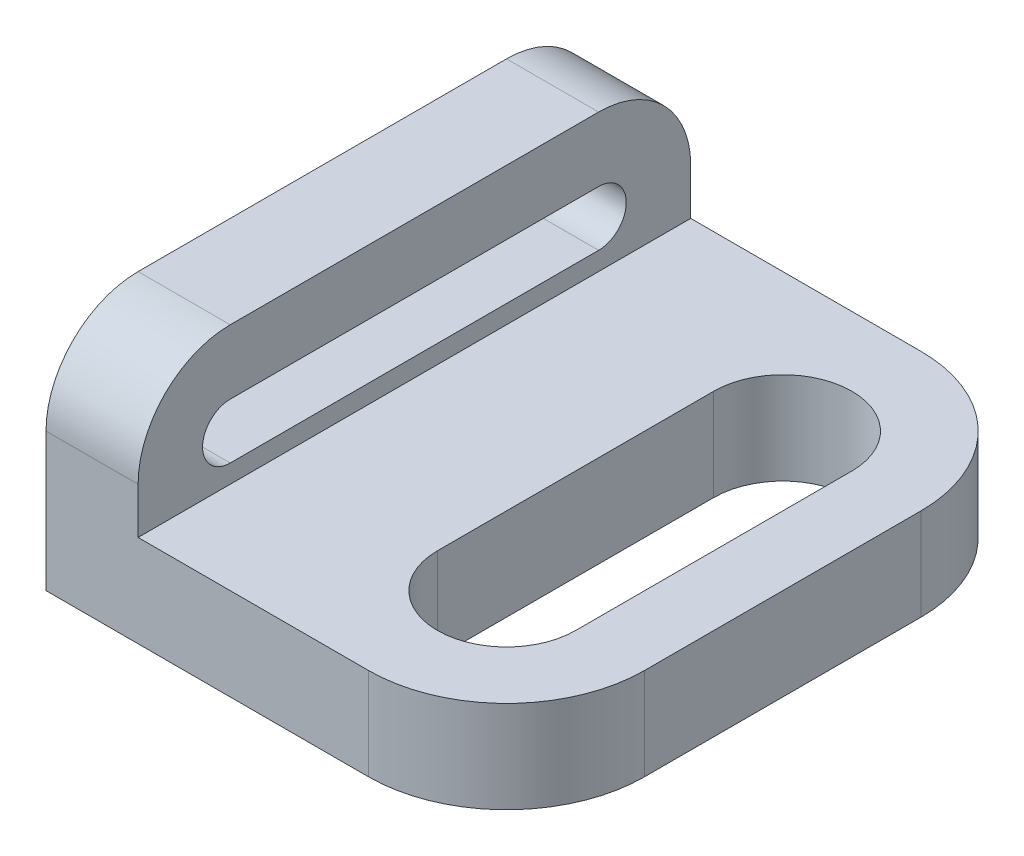
ISO-10303-21;
HEADER;
FILE_DESCRIPTION(('STEP AP214'),'2;1');
FILE_NAME('part.step','',(''),(''),'','','');
FILE_SCHEMA(('AUTOMOTIVE_DESIGN { 1 0 10303 214 1 1 1 1 }'));
ENDSEC;
DATA;
#1=APPLICATION_CONTEXT('core data for automotive mechanical design processes');
#2=APPLICATION_PROTOCOL_DEFINITION('international standard','automotive_design',2000,#1);
#3=PRODUCT_CONTEXT('',#1,'mechanical');
#4=PRODUCT('Part','Part','',(#3));
#5=PRODUCT_RELATED_PRODUCT_CATEGORY('part','',(#4));
#6=PRODUCT_DEFINITION_FORMATION('','',#4);
#7=PRODUCT_DEFINITION_CONTEXT('part definition',#1,'design');
#8=PRODUCT_DEFINITION('design','',#6,#7);
#9=PRODUCT_DEFINITION_SHAPE('','',#8);
#10=(LENGTH_UNIT() NAMED_UNIT(*) SI_UNIT(.MILLI.,.METRE.));
#11=(NAMED_UNIT(*) PLANE_ANGLE_UNIT() SI_UNIT($,.RADIAN.));
#12=(NAMED_UNIT(*) SI_UNIT($,.STERADIAN.) SOLID_ANGLE_UNIT());
#13=UNCERTAINTY_MEASURE_WITH_UNIT(LENGTH_MEASURE(1.E-05),#10,'distance_accuracy_value','');
#14=(GEOMETRIC_REPRESENTATION_CONTEXT(3) GLOBAL_UNCERTAINTY_ASSIGNED_CONTEXT((#13)) GLOBAL_UNIT_ASSIGNED_CONTEXT((#10,
#11,#12)) REPRESENTATION_CONTEXT('',''));
#15=CARTESIAN_POINT('',(0.,0.,0.));
#16=DIRECTION('',(0.,0.,1.));
#17=DIRECTION('',(1.,0.,0.));
#18=AXIS2_PLACEMENT_3D('',#15,#16,#17);
#19=CARTESIAN_POINT('',(0.,20.,0.));
#20=DIRECTION('',(0.,0.,-1.));
#21=DIRECTION('',(-1.,0.,0.));
#22=AXIS2_PLACEMENT_3D('',#19,#20,#21);
#23=PLANE('',#22);
#24=DIRECTION('',(0.,-1.,0.));
#25=VECTOR('',#24,1.);
#26=CARTESIAN_POINT('',(20.,50.,0.));
#27=LINE('',#26,#25);
#28=CARTESIAN_POINT('',(20.,30.,0.));
#29=VERTEX_POINT('',#28);
#30=CARTESIAN_POINT('',(20.,20.,0.));
#31=VERTEX_POINT('',#30);
#32=EDGE_CURVE('E229',#29,#31,#27,.T.);
#33=ORIENTED_EDGE('',*,*,#32,.F.);
#34=DIRECTION('',(1.,0.,0.));
#35=VECTOR('',#34,1.);
#36=CARTESIAN_POINT('',(0.,30.,0.));
#37=LINE('',#36,#35);
#38=CARTESIAN_POINT('',(0.,30.,0.));
#39=VERTEX_POINT('',#38);
#40=EDGE_CURVE('E11',#29,#39,#37,.F.);
#41=ORIENTED_EDGE('',*,*,#40,.T.);
#42=DIRECTION('',(0.,-1.,0.));
#43=VECTOR('',#42,1.);
#44=CARTESIAN_POINT('',(0.,50.,0.));
#45=LINE('',#44,#43);
#46=CARTESIAN_POINT('',(0.,0.,0.));
#47=VERTEX_POINT('',#46);
#48=EDGE_CURVE('E232',#39,#47,#45,.T.);
#49=ORIENTED_EDGE('',*,*,#48,.T.);
#50=DIRECTION('',(1.,0.,0.));
#51=VECTOR('',#50,1.);
#52=CARTESIAN_POINT('',(0.,0.,0.));
#53=LINE('',#52,#51);
#54=CARTESIAN_POINT('',(70.,0.,0.));
#55=VERTEX_POINT('',#54);
#56=EDGE_CURVE('E292',#47,#55,#53,.T.);
#57=ORIENTED_EDGE('',*,*,#56,.T.);
#58=DIRECTION('',(0.,-1.,0.));
#59=VECTOR('',#58,1.);
#60=CARTESIAN_POINT('',(70.,20.,0.));
#61=LINE('',#60,#59);
#62=CARTESIAN_POINT('',(70.,20.,0.));
#63=VERTEX_POINT('',#62);
#64=EDGE_CURVE('E321',#63,#55,#61,.T.);
#65=ORIENTED_EDGE('',*,*,#64,.F.);
#66=DIRECTION('',(1.,0.,0.));
#67=VECTOR('',#66,1.);
#68=CARTESIAN_POINT('',(0.,20.,0.));
#69=LINE('',#68,#67);
#70=EDGE_CURVE('E255',#31,#63,#69,.T.);
#71=ORIENTED_EDGE('',*,*,#70,.F.);
#72=EDGE_LOOP('',(#33,#41,#49,#57,#65,#71));
#73=FACE_BOUND('',#72,.T.);
#74=ADVANCED_FACE('F41',(#73),#23,.F.);
#75=CARTESIAN_POINT('',(70.,20.,-30.));
#76=DIRECTION('',(0.,-1.,0.));
#77=DIRECTION('',(0.,0.,-1.));
#78=AXIS2_PLACEMENT_3D('',#75,#76,#77);
#79=CYLINDRICAL_SURFACE('',#78,30.);
#80=CARTESIAN_POINT('',(70.,0.,-30.));
#81=DIRECTION('',(0.,1.,0.));
#82=DIRECTION('',(0.,0.,1.));
#83=AXIS2_PLACEMENT_3D('',#80,#81,#82);
#84=CIRCLE('',#83,30.);
#85=CARTESIAN_POINT('',(100.,0.,-30.));
#86=VERTEX_POINT('',#85);
#87=EDGE_CURVE('E296',#55,#86,#84,.T.);
#88=ORIENTED_EDGE('',*,*,#87,.T.);
#89=DIRECTION('',(0.,-1.,0.));
#90=VECTOR('',#89,1.);
#91=CARTESIAN_POINT('',(100.,20.,-30.));
#92=LINE('',#91,#90);
#93=CARTESIAN_POINT('',(100.,20.,-30.));
#94=VERTEX_POINT('',#93);
#95=EDGE_CURVE('E317',#94,#86,#92,.T.);
#96=ORIENTED_EDGE('',*,*,#95,.F.);
#97=CARTESIAN_POINT('',(70.,20.,-30.));
#98=DIRECTION('',(0.,1.,0.));
#99=DIRECTION('',(0.,0.,1.));
#100=AXIS2_PLACEMENT_3D('',#97,#98,#99);
#101=CIRCLE('',#100,30.);
#102=EDGE_CURVE('E259',#63,#94,#101,.T.);
#103=ORIENTED_EDGE('',*,*,#102,.F.);
#104=ORIENTED_EDGE('',*,*,#64,.T.);
#105=EDGE_LOOP('',(#88,#96,#103,#104));
#106=FACE_BOUND('',#105,.T.);
#107=ADVANCED_FACE('F397',(#106),#79,.T.);
#108=CARTESIAN_POINT('',(100.,20.,0.));
#109=DIRECTION('',(-1.,0.,0.));
#110=DIRECTION('',(0.,0.,1.));
#111=AXIS2_PLACEMENT_3D('',#108,#109,#110);
#112=PLANE('',#111);
#113=DIRECTION('',(0.,0.,-1.));
#114=VECTOR('',#113,1.);
#115=CARTESIAN_POINT('',(100.,0.,0.));
#116=LINE('',#115,#114);
#117=CARTESIAN_POINT('',(100.,0.,-90.));
#118=VERTEX_POINT('',#117);
#119=EDGE_CURVE('E299',#86,#118,#116,.T.);
#120=ORIENTED_EDGE('',*,*,#119,.T.);
#121=DIRECTION('',(0.,-1.,0.));
#122=VECTOR('',#121,1.);
#123=CARTESIAN_POINT('',(100.,20.,-90.));
#124=LINE('',#123,#122);
#125=CARTESIAN_POINT('',(100.,20.,-90.));
#126=VERTEX_POINT('',#125);
#127=EDGE_CURVE('E312',#126,#118,#124,.T.);
#128=ORIENTED_EDGE('',*,*,#127,.F.);
#129=DIRECTION('',(0.,0.,-1.));
#130=VECTOR('',#129,1.);
#131=CARTESIAN_POINT('',(100.,20.,0.));
#132=LINE('',#131,#130);
#133=EDGE_CURVE('E262',#94,#126,#132,.T.);
#134=ORIENTED_EDGE('',*,*,#133,.F.);
#135=ORIENTED_EDGE('',*,*,#95,.T.);
#136=EDGE_LOOP('',(#120,#128,#134,#135));
#137=FACE_BOUND('',#136,.T.);
#138=ADVANCED_FACE('F400',(#137),#112,.F.);
#139=CARTESIAN_POINT('',(70.,20.,-90.));
#140=DIRECTION('',(0.,-1.,0.));
#141=DIRECTION('',(0.,0.,-1.));
#142=AXIS2_PLACEMENT_3D('',#139,#140,#141);
#143=CYLINDRICAL_SURFACE('',#142,30.);
#144=CARTESIAN_POINT('',(70.,0.,-90.));
#145=DIRECTION('',(0.,1.,0.));
#146=DIRECTION('',(0.,0.,1.));
#147=AXIS2_PLACEMENT_3D('',#144,#145,#146);
#148=CIRCLE('',#147,30.);
#149=CARTESIAN_POINT('',(70.,0.,-120.));
#150=VERTEX_POINT('',#149);
#151=EDGE_CURVE('E302',#118,#150,#148,.T.);
#152=ORIENTED_EDGE('',*,*,#151,.T.);
#153=DIRECTION('',(0.,-1.,0.));
#154=VECTOR('',#153,1.);
#155=CARTESIAN_POINT('',(70.,20.,-120.));
#156=LINE('',#155,#154);
#157=CARTESIAN_POINT('',(70.,20.,-120.));
#158=VERTEX_POINT('',#157);
#159=EDGE_CURVE('E309',#158,#150,#156,.T.);
#160=ORIENTED_EDGE('',*,*,#159,.F.);
#161=CARTESIAN_POINT('',(70.,20.,-90.));
#162=DIRECTION('',(0.,1.,0.));
#163=DIRECTION('',(0.,0.,1.));
#164=AXIS2_PLACEMENT_3D('',#161,#162,#163);
#165=CIRCLE('',#164,30.);
#166=EDGE_CURVE('E265',#126,#158,#165,.T.);
#167=ORIENTED_EDGE('',*,*,#166,.F.);
#168=ORIENTED_EDGE('',*,*,#127,.T.);
#169=EDGE_LOOP('',(#152,#160,#167,#168));
#170=FACE_BOUND('',#169,.T.);
#171=ADVANCED_FACE('F390',(#170),#143,.T.);
#172=CARTESIAN_POINT('',(0.,20.,-120.));
#173=DIRECTION('',(0.,0.,-1.));
#174=DIRECTION('',(-1.,0.,0.));
#175=AXIS2_PLACEMENT_3D('',#172,#173,#174);
#176=PLANE('',#175);
#177=DIRECTION('',(0.,-1.,0.));
#178=VECTOR('',#177,1.);
#179=CARTESIAN_POINT('',(0.,50.,-120.));
#180=LINE('',#179,#178);
#181=CARTESIAN_POINT('',(0.,30.,-120.));
#182=VERTEX_POINT('',#181);
#183=CARTESIAN_POINT('',(0.,0.,-120.));
#184=VERTEX_POINT('',#183);
#185=EDGE_CURVE('E235',#182,#184,#180,.T.);
#186=ORIENTED_EDGE('',*,*,#185,.F.);
#187=DIRECTION('',(1.,0.,0.));
#188=VECTOR('',#187,1.);
#189=CARTESIAN_POINT('',(0.,30.,-120.));
#190=LINE('',#189,#188);
#191=CARTESIAN_POINT('',(20.,30.,-120.));
#192=VERTEX_POINT('',#191);
#193=EDGE_CURVE('E325',#182,#192,#190,.T.);
#194=ORIENTED_EDGE('',*,*,#193,.T.);
#195=DIRECTION('',(0.,-1.,0.));
#196=VECTOR('',#195,1.);
#197=CARTESIAN_POINT('',(20.,50.,-120.));
#198=LINE('',#197,#196);
#199=CARTESIAN_POINT('',(20.,20.,-120.));
#200=VERTEX_POINT('',#199);
#201=EDGE_CURVE('E223',#192,#200,#198,.T.);
#202=ORIENTED_EDGE('',*,*,#201,.T.);
#203=DIRECTION('',(1.,0.,0.));
#204=VECTOR('',#203,1.);
#205=CARTESIAN_POINT('',(0.,20.,-120.));
#206=LINE('',#205,#204);
#207=EDGE_CURVE('E268',#200,#158,#206,.T.);
#208=ORIENTED_EDGE('',*,*,#207,.T.);
#209=ORIENTED_EDGE('',*,*,#159,.T.);
#210=DIRECTION('',(1.,0.,0.));
#211=VECTOR('',#210,1.);
#212=CARTESIAN_POINT('',(0.,0.,-120.));
#213=LINE('',#212,#211);
#214=EDGE_CURVE('E244',#184,#150,#213,.T.);
#215=ORIENTED_EDGE('',*,*,#214,.F.);
#216=EDGE_LOOP('',(#186,#194,#202,#208,#209,#215));
#217=FACE_BOUND('',#216,.T.);
#218=ADVANCED_FACE('F364',(#217),#176,.T.);
#219=CARTESIAN_POINT('',(70.,20.,-30.));
#220=DIRECTION('',(0.,-1.,0.));
#221=DIRECTION('',(0.,0.,-1.));
#222=AXIS2_PLACEMENT_3D('',#219,#220,#221);
#223=CYLINDRICAL_SURFACE('',#222,15.);
#224=CARTESIAN_POINT('',(70.,0.,-30.));
#225=DIRECTION('',(0.,1.,0.));
#226=DIRECTION('',(0.,0.,1.));
#227=AXIS2_PLACEMENT_3D('',#224,#225,#226);
#228=CIRCLE('',#227,15.);
#229=CARTESIAN_POINT('',(55.,0.,-30.));
#230=VERTEX_POINT('',#229);
#231=CARTESIAN_POINT('',(85.,0.,-30.));
#232=VERTEX_POINT('',#231);
#233=EDGE_CURVE('E238',#230,#232,#228,.T.);
#234=ORIENTED_EDGE('',*,*,#233,.F.);
#235=DIRECTION('',(0.,-1.,0.));
#236=VECTOR('',#235,1.);
#237=CARTESIAN_POINT('',(55.,20.,-30.));
#238=LINE('',#237,#236);
#239=CARTESIAN_POINT('',(55.,20.,-30.));
#240=VERTEX_POINT('',#239);
#241=EDGE_CURVE('E313',#240,#230,#238,.T.);
#242=ORIENTED_EDGE('',*,*,#241,.F.);
#243=CARTESIAN_POINT('',(70.,20.,-30.));
#244=DIRECTION('',(0.,1.,0.));
#245=DIRECTION('',(0.,0.,1.));
#246=AXIS2_PLACEMENT_3D('',#243,#244,#245);
#247=CIRCLE('',#246,15.);
#248=CARTESIAN_POINT('',(85.,20.,-30.));
#249=VERTEX_POINT('',#248);
#250=EDGE_CURVE('E239',#240,#249,#247,.T.);
#251=ORIENTED_EDGE('',*,*,#250,.T.);
#252=DIRECTION('',(0.,-1.,0.));
#253=VECTOR('',#252,1.);
#254=CARTESIAN_POINT('',(85.,20.,-30.));
#255=LINE('',#254,#253);
#256=EDGE_CURVE('E276',#249,#232,#255,.T.);
#257=ORIENTED_EDGE('',*,*,#256,.T.);
#258=EDGE_LOOP('',(#234,#242,#251,#257));
#259=FACE_BOUND('',#258,.T.);
#260=ADVANCED_FACE('F425',(#259),#223,.F.);
#261=CARTESIAN_POINT('',(55.,20.,0.));
#262=DIRECTION('',(1.,0.,0.));
#263=DIRECTION('',(0.,0.,-1.));
#264=AXIS2_PLACEMENT_3D('',#261,#262,#263);
#265=PLANE('',#264);
#266=DIRECTION('',(0.,0.,1.));
#267=VECTOR('',#266,1.);
#268=CARTESIAN_POINT('',(55.,0.,0.));
#269=LINE('',#268,#267);
#270=CARTESIAN_POINT('',(55.,0.,-90.));
#271=VERTEX_POINT('',#270);
#272=EDGE_CURVE('E280',#271,#230,#269,.T.);
#273=ORIENTED_EDGE('',*,*,#272,.F.);
#274=DIRECTION('',(0.,-1.,0.));
#275=VECTOR('',#274,1.);
#276=CARTESIAN_POINT('',(55.,20.,-90.));
#277=LINE('',#276,#275);
#278=CARTESIAN_POINT('',(55.,20.,-90.));
#279=VERTEX_POINT('',#278);
#280=EDGE_CURVE('E331',#279,#271,#277,.T.);
#281=ORIENTED_EDGE('',*,*,#280,.F.);
#282=DIRECTION('',(0.,0.,1.));
#283=VECTOR('',#282,1.);
#284=CARTESIAN_POINT('',(55.,20.,0.));
#285=LINE('',#284,#283);
#286=EDGE_CURVE('E243',#279,#240,#285,.T.);
#287=ORIENTED_EDGE('',*,*,#286,.T.);
#288=ORIENTED_EDGE('',*,*,#241,.T.);
#289=EDGE_LOOP('',(#273,#281,#287,#288));
#290=FACE_BOUND('',#289,.T.);
#291=ADVANCED_FACE('F421',(#290),#265,.T.);
#292=CARTESIAN_POINT('',(70.,20.,-90.));
#293=DIRECTION('',(0.,-1.,0.));
#294=DIRECTION('',(0.,0.,-1.));
#295=AXIS2_PLACEMENT_3D('',#292,#293,#294);
#296=CYLINDRICAL_SURFACE('',#295,15.);
#297=CARTESIAN_POINT('',(70.,0.,-90.));
#298=DIRECTION('',(0.,1.,0.));
#299=DIRECTION('',(0.,0.,1.));
#300=AXIS2_PLACEMENT_3D('',#297,#298,#299);
#301=CIRCLE('',#300,15.);
#302=CARTESIAN_POINT('',(85.,0.,-90.));
#303=VERTEX_POINT('',#302);
#304=EDGE_CURVE('E284',#303,#271,#301,.T.);
#305=ORIENTED_EDGE('',*,*,#304,.F.);
#306=DIRECTION('',(0.,-1.,0.));
#307=VECTOR('',#306,1.);
#308=CARTESIAN_POINT('',(85.,20.,-90.));
#309=LINE('',#308,#307);
#310=CARTESIAN_POINT('',(85.,20.,-90.));
#311=VERTEX_POINT('',#310);
#312=EDGE_CURVE('E328',#311,#303,#309,.T.);
#313=ORIENTED_EDGE('',*,*,#312,.F.);
#314=CARTESIAN_POINT('',(70.,20.,-90.));
#315=DIRECTION('',(0.,1.,0.));
#316=DIRECTION('',(0.,0.,1.));
#317=AXIS2_PLACEMENT_3D('',#314,#315,#316);
#318=CIRCLE('',#317,15.);
#319=EDGE_CURVE('E248',#311,#279,#318,.T.);
#320=ORIENTED_EDGE('',*,*,#319,.T.);
#321=ORIENTED_EDGE('',*,*,#280,.T.);
#322=EDGE_LOOP('',(#305,#313,#320,#321));
#323=FACE_BOUND('',#322,.T.);
#324=ADVANCED_FACE('F417',(#323),#296,.F.);
#325=CARTESIAN_POINT('',(85.,20.,0.));
#326=DIRECTION('',(1.,0.,0.));
#327=DIRECTION('',(0.,0.,-1.));
#328=AXIS2_PLACEMENT_3D('',#325,#326,#327);
#329=PLANE('',#328);
#330=DIRECTION('',(0.,0.,1.));
#331=VECTOR('',#330,1.);
#332=CARTESIAN_POINT('',(85.,0.,0.));
#333=LINE('',#332,#331);
#334=EDGE_CURVE('E288',#303,#232,#333,.T.);
#335=ORIENTED_EDGE('',*,*,#334,.T.);
#336=ORIENTED_EDGE('',*,*,#256,.F.);
#337=DIRECTION('',(0.,0.,1.));
#338=VECTOR('',#337,1.);
#339=CARTESIAN_POINT('',(85.,20.,0.));
#340=LINE('',#339,#338);
#341=EDGE_CURVE('E252',#311,#249,#340,.T.);
#342=ORIENTED_EDGE('',*,*,#341,.F.);
#343=ORIENTED_EDGE('',*,*,#312,.T.);
#344=EDGE_LOOP('',(#335,#336,#342,#343));
#345=FACE_BOUND('',#344,.T.);
#346=ADVANCED_FACE('F414',(#345),#329,.F.);
#347=CARTESIAN_POINT('',(0.,20.,0.));
#348=DIRECTION('',(0.,1.,0.));
#349=DIRECTION('',(0.,0.,1.));
#350=AXIS2_PLACEMENT_3D('',#347,#348,#349);
#351=PLANE('',#350);
#352=ORIENTED_EDGE('',*,*,#250,.F.);
#353=ORIENTED_EDGE('',*,*,#286,.F.);
#354=ORIENTED_EDGE('',*,*,#319,.F.);
#355=ORIENTED_EDGE('',*,*,#341,.T.);
#356=EDGE_LOOP('',(#352,#353,#354,#355));
#357=FACE_BOUND('',#356,.T.);
#358=ORIENTED_EDGE('',*,*,#70,.T.);
#359=ORIENTED_EDGE('',*,*,#102,.T.);
#360=ORIENTED_EDGE('',*,*,#133,.T.);
#361=ORIENTED_EDGE('',*,*,#166,.T.);
#362=ORIENTED_EDGE('',*,*,#207,.F.);
#363=DIRECTION('',(0.,0.,1.));
#364=VECTOR('',#363,1.);
#365=CARTESIAN_POINT('',(20.,20.,0.));
#366=LINE('',#365,#364);
#367=EDGE_CURVE('E272',#200,#31,#366,.T.);
#368=ORIENTED_EDGE('',*,*,#367,.T.);
#369=EDGE_LOOP('',(#358,#359,#360,#361,#362,#368));
#370=FACE_BOUND('',#369,.T.);
#371=ADVANCED_FACE('F383',(#357,#370),#351,.T.);
#372=CARTESIAN_POINT('',(0.,0.,0.));
#373=DIRECTION('',(0.,1.,0.));
#374=DIRECTION('',(0.,0.,1.));
#375=AXIS2_PLACEMENT_3D('',#372,#373,#374);
#376=PLANE('',#375);
#377=ORIENTED_EDGE('',*,*,#233,.T.);
#378=ORIENTED_EDGE('',*,*,#334,.F.);
#379=ORIENTED_EDGE('',*,*,#304,.T.);
#380=ORIENTED_EDGE('',*,*,#272,.T.);
#381=EDGE_LOOP('',(#377,#378,#379,#380));
#382=FACE_BOUND('',#381,.T.);
#383=ORIENTED_EDGE('',*,*,#56,.F.);
#384=DIRECTION('',(0.,0.,-1.));
#385=VECTOR('',#384,1.);
#386=CARTESIAN_POINT('',(0.,0.,0.));
#387=LINE('',#386,#385);
#388=EDGE_CURVE('E209',#47,#184,#387,.T.);
#389=ORIENTED_EDGE('',*,*,#388,.T.);
#390=ORIENTED_EDGE('',*,*,#214,.T.);
#391=ORIENTED_EDGE('',*,*,#151,.F.);
#392=ORIENTED_EDGE('',*,*,#119,.F.);
#393=ORIENTED_EDGE('',*,*,#87,.F.);
#394=EDGE_LOOP('',(#383,#389,#390,#391,#392,#393));
#395=FACE_BOUND('',#394,.T.);
#396=ADVANCED_FACE('F395',(#382,#395),#376,.F.);
#397=CARTESIAN_POINT('',(20.,50.,0.));
#398=DIRECTION('',(1.,0.,0.));
#399=DIRECTION('',(0.,0.,-1.));
#400=AXIS2_PLACEMENT_3D('',#397,#398,#399);
#401=PLANE('',#400);
#402=CARTESIAN_POINT('',(20.,30.,-20.));
#403=DIRECTION('',(1.,0.,0.));
#404=DIRECTION('',(0.,0.,-1.));
#405=AXIS2_PLACEMENT_3D('',#402,#403,#404);
#406=CIRCLE('',#405,6.);
#407=CARTESIAN_POINT('',(20.,36.,-20.));
#408=VERTEX_POINT('',#407);
#409=CARTESIAN_POINT('',(20.,24.,-20.));
#410=VERTEX_POINT('',#409);
#411=EDGE_CURVE('E57',#408,#410,#406,.T.);
#412=ORIENTED_EDGE('',*,*,#411,.F.);
#413=DIRECTION('',(0.,0.,1.));
#414=VECTOR('',#413,1.);
#415=CARTESIAN_POINT('',(20.,36.,-20.));
#416=LINE('',#415,#414);
#417=CARTESIAN_POINT('',(20.,36.,-100.));
#418=VERTEX_POINT('',#417);
#419=EDGE_CURVE('E187',#418,#408,#416,.T.);
#420=ORIENTED_EDGE('',*,*,#419,.F.);
#421=CARTESIAN_POINT('',(20.,30.,-100.));
#422=DIRECTION('',(1.,0.,0.));
#423=DIRECTION('',(0.,0.,-1.));
#424=AXIS2_PLACEMENT_3D('',#421,#422,#423);
#425=CIRCLE('',#424,6.00000000000001);
#426=CARTESIAN_POINT('',(20.,24.,-100.));
#427=VERTEX_POINT('',#426);
#428=EDGE_CURVE('E191',#427,#418,#425,.T.);
#429=ORIENTED_EDGE('',*,*,#428,.F.);
#430=DIRECTION('',(0.,0.,-1.));
#431=VECTOR('',#430,1.);
#432=CARTESIAN_POINT('',(20.,24.,-20.));
#433=LINE('',#432,#431);
#434=EDGE_CURVE('E200',#410,#427,#433,.T.);
#435=ORIENTED_EDGE('',*,*,#434,.F.);
#436=EDGE_LOOP('',(#412,#420,#429,#435));
#437=FACE_BOUND('',#436,.T.);
#438=ORIENTED_EDGE('',*,*,#201,.F.);
#439=CARTESIAN_POINT('',(20.,30.,-100.));
#440=DIRECTION('',(1.,0.,0.));
#441=DIRECTION('',(0.,0.,-1.));
#442=AXIS2_PLACEMENT_3D('',#439,#440,#441);
#443=CIRCLE('',#442,20.);
#444=CARTESIAN_POINT('',(20.,50.,-100.));
#445=VERTEX_POINT('',#444);
#446=EDGE_CURVE('E342',#192,#445,#443,.T.);
#447=ORIENTED_EDGE('',*,*,#446,.T.);
#448=DIRECTION('',(0.,0.,1.));
#449=VECTOR('',#448,1.);
#450=CARTESIAN_POINT('',(20.,50.,0.));
#451=LINE('',#450,#449);
#452=CARTESIAN_POINT('',(20.,50.,-20.));
#453=VERTEX_POINT('',#452);
#454=EDGE_CURVE('E219',#445,#453,#451,.T.);
#455=ORIENTED_EDGE('',*,*,#454,.T.);
#456=CARTESIAN_POINT('',(20.,30.,-20.));
#457=DIRECTION('',(1.,0.,0.));
#458=DIRECTION('',(0.,0.,-1.));
#459=AXIS2_PLACEMENT_3D('',#456,#457,#458);
#460=CIRCLE('',#459,20.);
#461=EDGE_CURVE('E339',#453,#29,#460,.T.);
#462=ORIENTED_EDGE('',*,*,#461,.T.);
#463=ORIENTED_EDGE('',*,*,#32,.T.);
#464=ORIENTED_EDGE('',*,*,#367,.F.);
#465=EDGE_LOOP('',(#438,#447,#455,#462,#463,#464));
#466=FACE_BOUND('',#465,.T.);
#467=ADVANCED_FACE('F369',(#437,#466),#401,.T.);
#468=CARTESIAN_POINT('',(0.,50.,0.));
#469=DIRECTION('',(-1.,0.,0.));
#470=DIRECTION('',(0.,0.,1.));
#471=AXIS2_PLACEMENT_3D('',#468,#469,#470);
#472=PLANE('',#471);
#473=CARTESIAN_POINT('',(0.,30.,-20.));
#474=DIRECTION('',(1.,0.,0.));
#475=DIRECTION('',(0.,0.,-1.));
#476=AXIS2_PLACEMENT_3D('',#473,#474,#475);
#477=CIRCLE('',#476,6.);
#478=CARTESIAN_POINT('',(0.,36.,-20.));
#479=VERTEX_POINT('',#478);
#480=CARTESIAN_POINT('',(0.,24.,-20.));
#481=VERTEX_POINT('',#480);
#482=EDGE_CURVE('E168',#479,#481,#477,.T.);
#483=ORIENTED_EDGE('',*,*,#482,.T.);
#484=DIRECTION('',(0.,0.,-1.));
#485=VECTOR('',#484,1.);
#486=CARTESIAN_POINT('',(0.,24.,-20.));
#487=LINE('',#486,#485);
#488=CARTESIAN_POINT('',(0.,24.,-100.));
#489=VERTEX_POINT('',#488);
#490=EDGE_CURVE('E178',#481,#489,#487,.T.);
#491=ORIENTED_EDGE('',*,*,#490,.T.);
#492=CARTESIAN_POINT('',(0.,30.,-100.));
#493=DIRECTION('',(1.,0.,0.));
#494=DIRECTION('',(0.,0.,-1.));
#495=AXIS2_PLACEMENT_3D('',#492,#493,#494);
#496=CIRCLE('',#495,6.00000000000001);
#497=CARTESIAN_POINT('',(0.,36.,-100.));
#498=VERTEX_POINT('',#497);
#499=EDGE_CURVE('E65',#489,#498,#496,.T.);
#500=ORIENTED_EDGE('',*,*,#499,.T.);
#501=DIRECTION('',(0.,0.,1.));
#502=VECTOR('',#501,1.);
#503=CARTESIAN_POINT('',(0.,36.,-20.));
#504=LINE('',#503,#502);
#505=EDGE_CURVE('E175',#498,#479,#504,.T.);
#506=ORIENTED_EDGE('',*,*,#505,.T.);
#507=EDGE_LOOP('',(#483,#491,#500,#506));
#508=FACE_BOUND('',#507,.T.);
#509=DIRECTION('',(0.,0.,-1.));
#510=VECTOR('',#509,1.);
#511=CARTESIAN_POINT('',(0.,50.,0.));
#512=LINE('',#511,#510);
#513=CARTESIAN_POINT('',(0.,50.,-20.));
#514=VERTEX_POINT('',#513);
#515=CARTESIAN_POINT('',(0.,50.,-100.));
#516=VERTEX_POINT('',#515);
#517=EDGE_CURVE('E215',#514,#516,#512,.T.);
#518=ORIENTED_EDGE('',*,*,#517,.T.);
#519=CARTESIAN_POINT('',(0.,30.,-100.));
#520=DIRECTION('',(-1.,0.,0.));
#521=DIRECTION('',(0.,0.,1.));
#522=AXIS2_PLACEMENT_3D('',#519,#520,#521);
#523=CIRCLE('',#522,20.);
#524=EDGE_CURVE('E50',#516,#182,#523,.T.);
#525=ORIENTED_EDGE('',*,*,#524,.T.);
#526=ORIENTED_EDGE('',*,*,#185,.T.);
#527=ORIENTED_EDGE('',*,*,#388,.F.);
#528=ORIENTED_EDGE('',*,*,#48,.F.);
#529=CARTESIAN_POINT('',(0.,30.,-20.));
#530=DIRECTION('',(-1.,0.,0.));
#531=DIRECTION('',(0.,0.,1.));
#532=AXIS2_PLACEMENT_3D('',#529,#530,#531);
#533=CIRCLE('',#532,20.);
#534=EDGE_CURVE('E352',#39,#514,#533,.T.);
#535=ORIENTED_EDGE('',*,*,#534,.T.);
#536=EDGE_LOOP('',(#518,#525,#526,#527,#528,#535));
#537=FACE_BOUND('',#536,.T.);
#538=ADVANCED_FACE('F183',(#508,#537),#472,.T.);
#539=CARTESIAN_POINT('',(0.,50.,0.));
#540=DIRECTION('',(0.,1.,0.));
#541=DIRECTION('',(0.,0.,1.));
#542=AXIS2_PLACEMENT_3D('',#539,#540,#541);
#543=PLANE('',#542);
#544=ORIENTED_EDGE('',*,*,#454,.F.);
#545=DIRECTION('',(1.,0.,0.));
#546=VECTOR('',#545,1.);
#547=CARTESIAN_POINT('',(0.,50.,-100.));
#548=LINE('',#547,#546);
#549=EDGE_CURVE('E349',#445,#516,#548,.F.);
#550=ORIENTED_EDGE('',*,*,#549,.T.);
#551=ORIENTED_EDGE('',*,*,#517,.F.);
#552=DIRECTION('',(1.,0.,0.));
#553=VECTOR('',#552,1.);
#554=CARTESIAN_POINT('',(20.,50.,-20.));
#555=LINE('',#554,#553);
#556=EDGE_CURVE('E345',#514,#453,#555,.T.);
#557=ORIENTED_EDGE('',*,*,#556,.T.);
#558=EDGE_LOOP('',(#544,#550,#551,#557));
#559=FACE_BOUND('',#558,.T.);
#560=ADVANCED_FACE('F372',(#559),#543,.T.);
#561=CARTESIAN_POINT('',(0.,30.,-100.));
#562=DIRECTION('',(1.,0.,0.));
#563=DIRECTION('',(0.,0.,-1.));
#564=AXIS2_PLACEMENT_3D('',#561,#562,#563);
#565=CYLINDRICAL_SURFACE('',#564,20.);
#566=ORIENTED_EDGE('',*,*,#524,.F.);
#567=ORIENTED_EDGE('',*,*,#549,.F.);
#568=ORIENTED_EDGE('',*,*,#446,.F.);
#569=ORIENTED_EDGE('',*,*,#193,.F.);
#570=EDGE_LOOP('',(#566,#567,#568,#569));
#571=FACE_BOUND('',#570,.T.);
#572=ADVANCED_FACE('F366',(#571),#565,.T.);
#573=CARTESIAN_POINT('',(0.,30.,-20.));
#574=DIRECTION('',(-1.,0.,0.));
#575=DIRECTION('',(0.,0.,1.));
#576=AXIS2_PLACEMENT_3D('',#573,#574,#575);
#577=CYLINDRICAL_SURFACE('',#576,20.);
#578=ORIENTED_EDGE('',*,*,#534,.F.);
#579=ORIENTED_EDGE('',*,*,#40,.F.);
#580=ORIENTED_EDGE('',*,*,#461,.F.);
#581=ORIENTED_EDGE('',*,*,#556,.F.);
#582=EDGE_LOOP('',(#578,#579,#580,#581));
#583=FACE_BOUND('',#582,.T.);
#584=ADVANCED_FACE('F43',(#583),#577,.T.);
#585=CARTESIAN_POINT('',(0.,30.,-20.));
#586=DIRECTION('',(1.,0.,0.));
#587=DIRECTION('',(0.,0.,-1.));
#588=AXIS2_PLACEMENT_3D('',#585,#586,#587);
#589=CYLINDRICAL_SURFACE('',#588,6.);
#590=ORIENTED_EDGE('',*,*,#411,.T.);
#591=DIRECTION('',(1.,0.,0.));
#592=VECTOR('',#591,1.);
#593=CARTESIAN_POINT('',(0.,24.,-20.));
#594=LINE('',#593,#592);
#595=EDGE_CURVE('E164',#481,#410,#594,.T.);
#596=ORIENTED_EDGE('',*,*,#595,.F.);
#597=ORIENTED_EDGE('',*,*,#482,.F.);
#598=DIRECTION('',(1.,0.,0.));
#599=VECTOR('',#598,1.);
#600=CARTESIAN_POINT('',(0.,36.,-20.));
#601=LINE('',#600,#599);
#602=EDGE_CURVE('E206',#479,#408,#601,.T.);
#603=ORIENTED_EDGE('',*,*,#602,.T.);
#604=EDGE_LOOP('',(#590,#596,#597,#603));
#605=FACE_BOUND('',#604,.T.);
#606=ADVANCED_FACE('F166',(#605),#589,.F.);
#607=CARTESIAN_POINT('',(0.,36.,-20.));
#608=DIRECTION('',(0.,1.,0.));
#609=DIRECTION('',(0.,0.,1.));
#610=AXIS2_PLACEMENT_3D('',#607,#608,#609);
#611=PLANE('',#610);
#612=ORIENTED_EDGE('',*,*,#419,.T.);
#613=ORIENTED_EDGE('',*,*,#602,.F.);
#614=ORIENTED_EDGE('',*,*,#505,.F.);
#615=DIRECTION('',(1.,0.,0.));
#616=VECTOR('',#615,1.);
#617=CARTESIAN_POINT('',(0.,36.,-100.));
#618=LINE('',#617,#616);
#619=EDGE_CURVE('E210',#498,#418,#618,.T.);
#620=ORIENTED_EDGE('',*,*,#619,.T.);
#621=EDGE_LOOP('',(#612,#613,#614,#620));
#622=FACE_BOUND('',#621,.T.);
#623=ADVANCED_FACE('F499',(#622),#611,.F.);
#624=CARTESIAN_POINT('',(0.,30.,-100.));
#625=DIRECTION('',(1.,0.,0.));
#626=DIRECTION('',(0.,0.,-1.));
#627=AXIS2_PLACEMENT_3D('',#624,#625,#626);
#628=CYLINDRICAL_SURFACE('',#627,6.00000000000001);
#629=ORIENTED_EDGE('',*,*,#428,.T.);
#630=ORIENTED_EDGE('',*,*,#619,.F.);
#631=ORIENTED_EDGE('',*,*,#499,.F.);
#632=DIRECTION('',(1.,0.,0.));
#633=VECTOR('',#632,1.);
#634=CARTESIAN_POINT('',(0.,24.,-100.));
#635=LINE('',#634,#633);
#636=EDGE_CURVE('E174',#489,#427,#635,.T.);
#637=ORIENTED_EDGE('',*,*,#636,.T.);
#638=EDGE_LOOP('',(#629,#630,#631,#637));
#639=FACE_BOUND('',#638,.T.);
#640=ADVANCED_FACE('F508',(#639),#628,.F.);
#641=CARTESIAN_POINT('',(0.,24.,-20.));
#642=DIRECTION('',(0.,-1.,0.));
#643=DIRECTION('',(0.,0.,-1.));
#644=AXIS2_PLACEMENT_3D('',#641,#642,#643);
#645=PLANE('',#644);
#646=ORIENTED_EDGE('',*,*,#434,.T.);
#647=ORIENTED_EDGE('',*,*,#636,.F.);
#648=ORIENTED_EDGE('',*,*,#490,.F.);
#649=ORIENTED_EDGE('',*,*,#595,.T.);
#650=EDGE_LOOP('',(#646,#647,#648,#649));
#651=FACE_BOUND('',#650,.T.);
#652=ADVANCED_FACE('F179',(#651),#645,.F.);
#653=CLOSED_SHELL('',(#74,#107,#138,#171,#218,#260,#291,#324,#346,#371,#396,#467,#538,#560,#572,
#584,#606,#623,#640,#652));
#654=MANIFOLD_SOLID_BREP('B2',#653);
#655=ADVANCED_BREP_SHAPE_REPRESENTATION('',(#18,#654),#14);
#656=SHAPE_DEFINITION_REPRESENTATION(#9,#655);
ENDSEC;
END-ISO-10303-21;
